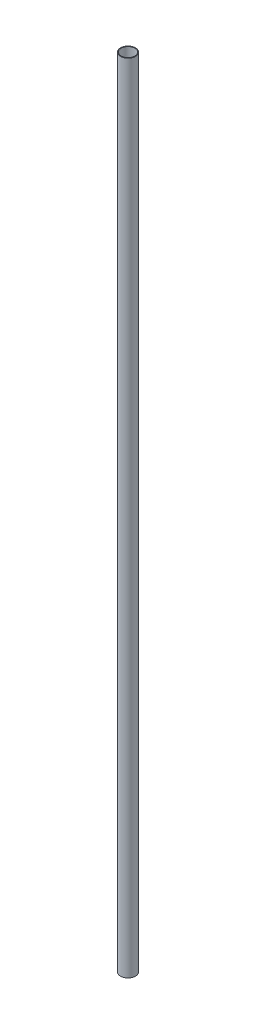
ISO-10303-21;
HEADER;
FILE_DESCRIPTION(('STEP AP214'),'2;1');
FILE_NAME('part.step','',(''),(''),'','','');
FILE_SCHEMA(('AUTOMOTIVE_DESIGN { 1 0 10303 214 1 1 1 1 }'));
ENDSEC;
DATA;
#1=APPLICATION_CONTEXT('core data for automotive mechanical design processes');
#2=APPLICATION_PROTOCOL_DEFINITION('international standard','automotive_design',2000,#1);
#3=PRODUCT_CONTEXT('',#1,'mechanical');
#4=PRODUCT('Part','Part','',(#3));
#5=PRODUCT_RELATED_PRODUCT_CATEGORY('part','',(#4));
#6=PRODUCT_DEFINITION_FORMATION('','',#4);
#7=PRODUCT_DEFINITION_CONTEXT('part definition',#1,'design');
#8=PRODUCT_DEFINITION('design','',#6,#7);
#9=PRODUCT_DEFINITION_SHAPE('','',#8);
#10=(LENGTH_UNIT() NAMED_UNIT(*) SI_UNIT(.MILLI.,.METRE.));
#11=(NAMED_UNIT(*) PLANE_ANGLE_UNIT() SI_UNIT($,.RADIAN.));
#12=(NAMED_UNIT(*) SI_UNIT($,.STERADIAN.) SOLID_ANGLE_UNIT());
#13=UNCERTAINTY_MEASURE_WITH_UNIT(LENGTH_MEASURE(1.E-05),#10,'distance_accuracy_value','');
#14=(GEOMETRIC_REPRESENTATION_CONTEXT(3) GLOBAL_UNCERTAINTY_ASSIGNED_CONTEXT((#13)) GLOBAL_UNIT_ASSIGNED_CONTEXT((#10,
#11,#12)) REPRESENTATION_CONTEXT('',''));
#15=CARTESIAN_POINT('',(0.,0.,0.));
#16=DIRECTION('',(0.,0.,1.));
#17=DIRECTION('',(1.,0.,0.));
#18=AXIS2_PLACEMENT_3D('',#15,#16,#17);
#19=CARTESIAN_POINT('',(0.,1016.,0.));
#20=DIRECTION('',(0.,1.,0.));
#21=DIRECTION('',(0.,0.,1.));
#22=AXIS2_PLACEMENT_3D('',#19,#20,#21);
#23=PLANE('',#22);
#24=CARTESIAN_POINT('',(0.,1016.,0.));
#25=DIRECTION('',(0.,1.,0.));
#26=DIRECTION('',(0.,0.,1.));
#27=AXIS2_PLACEMENT_3D('',#24,#25,#26);
#28=CIRCLE('',#27,9.525);
#29=CARTESIAN_POINT('',(0.,1016.,9.525));
#30=VERTEX_POINT('',#29);
#31=EDGE_CURVE('E10',#30,#30,#28,.T.);
#32=ORIENTED_EDGE('',*,*,#31,.T.);
#33=EDGE_LOOP('',(#32));
#34=FACE_BOUND('',#33,.T.);
#35=CARTESIAN_POINT('',(0.,1016.,0.));
#36=DIRECTION('',(0.,1.,0.));
#37=DIRECTION('',(0.,0.,1.));
#38=AXIS2_PLACEMENT_3D('',#35,#36,#37);
#39=CIRCLE('',#38,8.636);
#40=CARTESIAN_POINT('',(0.,1016.,8.636));
#41=VERTEX_POINT('',#40);
#42=EDGE_CURVE('E39',#41,#41,#39,.T.);
#43=ORIENTED_EDGE('',*,*,#42,.F.);
#44=EDGE_LOOP('',(#43));
#45=FACE_BOUND('',#44,.T.);
#46=ADVANCED_FACE('F28',(#34,#45),#23,.T.);
#47=CARTESIAN_POINT('',(0.,0.,0.));
#48=DIRECTION('',(0.,1.,0.));
#49=DIRECTION('',(0.,0.,1.));
#50=AXIS2_PLACEMENT_3D('',#47,#48,#49);
#51=PLANE('',#50);
#52=CARTESIAN_POINT('',(0.,0.,0.));
#53=DIRECTION('',(0.,1.,0.));
#54=DIRECTION('',(0.,0.,1.));
#55=AXIS2_PLACEMENT_3D('',#52,#53,#54);
#56=CIRCLE('',#55,9.525);
#57=CARTESIAN_POINT('',(0.,0.,9.525));
#58=VERTEX_POINT('',#57);
#59=EDGE_CURVE('E32',#58,#58,#56,.T.);
#60=ORIENTED_EDGE('',*,*,#59,.F.);
#61=EDGE_LOOP('',(#60));
#62=FACE_BOUND('',#61,.T.);
#63=CARTESIAN_POINT('',(0.,0.,0.));
#64=DIRECTION('',(0.,1.,0.));
#65=DIRECTION('',(0.,0.,1.));
#66=AXIS2_PLACEMENT_3D('',#63,#64,#65);
#67=CIRCLE('',#66,8.636);
#68=CARTESIAN_POINT('',(0.,0.,8.636));
#69=VERTEX_POINT('',#68);
#70=EDGE_CURVE('E41',#69,#69,#67,.T.);
#71=ORIENTED_EDGE('',*,*,#70,.T.);
#72=EDGE_LOOP('',(#71));
#73=FACE_BOUND('',#72,.T.);
#74=ADVANCED_FACE('F51',(#62,#73),#51,.F.);
#75=CARTESIAN_POINT('',(0.,1016.,0.));
#76=DIRECTION('',(0.,-1.,0.));
#77=DIRECTION('',(0.,0.,-1.));
#78=AXIS2_PLACEMENT_3D('',#75,#76,#77);
#79=CYLINDRICAL_SURFACE('',#78,9.525);
#80=ORIENTED_EDGE('',*,*,#31,.F.);
#81=EDGE_LOOP('',(#80));
#82=FACE_BOUND('',#81,.T.);
#83=ORIENTED_EDGE('',*,*,#59,.T.);
#84=EDGE_LOOP('',(#83));
#85=FACE_BOUND('',#84,.T.);
#86=ADVANCED_FACE('F30',(#82,#85),#79,.T.);
#87=CARTESIAN_POINT('',(0.,1016.,0.));
#88=DIRECTION('',(0.,-1.,0.));
#89=DIRECTION('',(0.,0.,-1.));
#90=AXIS2_PLACEMENT_3D('',#87,#88,#89);
#91=CYLINDRICAL_SURFACE('',#90,8.636);
#92=ORIENTED_EDGE('',*,*,#42,.T.);
#93=EDGE_LOOP('',(#92));
#94=FACE_BOUND('',#93,.T.);
#95=ORIENTED_EDGE('',*,*,#70,.F.);
#96=EDGE_LOOP('',(#95));
#97=FACE_BOUND('',#96,.T.);
#98=ADVANCED_FACE('F47',(#94,#97),#91,.F.);
#99=CLOSED_SHELL('',(#46,#74,#86,#98));
#100=MANIFOLD_SOLID_BREP('B2',#99);
#101=ADVANCED_BREP_SHAPE_REPRESENTATION('',(#18,#100),#14);
#102=SHAPE_DEFINITION_REPRESENTATION(#9,#101);
ENDSEC;
END-ISO-10303-21;
